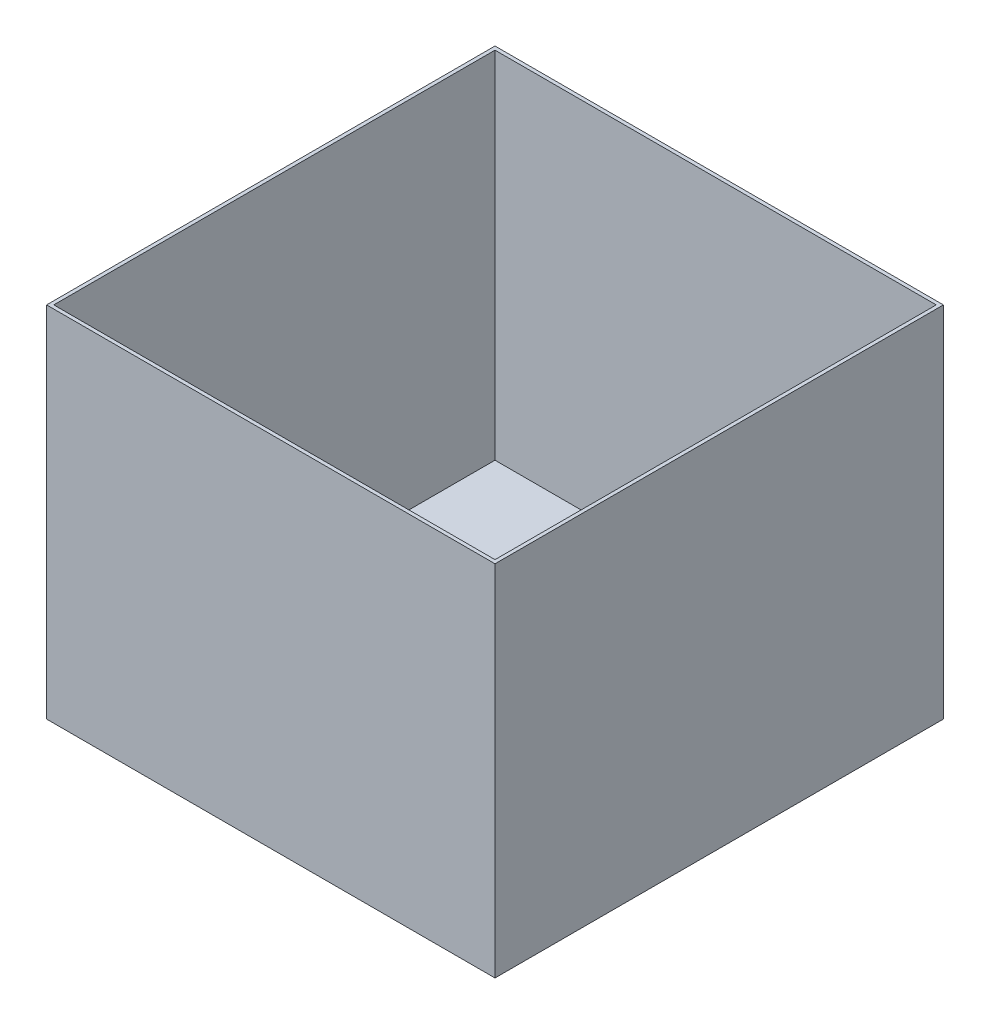
ISO-10303-21;
HEADER;
FILE_DESCRIPTION(('STEP AP214'),'2;1');
FILE_NAME('part.step','',(''),(''),'','','');
FILE_SCHEMA(('AUTOMOTIVE_DESIGN { 1 0 10303 214 1 1 1 1 }'));
ENDSEC;
DATA;
#1=APPLICATION_CONTEXT('core data for automotive mechanical design processes');
#2=APPLICATION_PROTOCOL_DEFINITION('international standard','automotive_design',2000,#1);
#3=PRODUCT_CONTEXT('',#1,'mechanical');
#4=PRODUCT('Part','Part','',(#3));
#5=PRODUCT_RELATED_PRODUCT_CATEGORY('part','',(#4));
#6=PRODUCT_DEFINITION_FORMATION('','',#4);
#7=PRODUCT_DEFINITION_CONTEXT('part definition',#1,'design');
#8=PRODUCT_DEFINITION('design','',#6,#7);
#9=PRODUCT_DEFINITION_SHAPE('','',#8);
#10=(LENGTH_UNIT() NAMED_UNIT(*) SI_UNIT(.MILLI.,.METRE.));
#11=(NAMED_UNIT(*) PLANE_ANGLE_UNIT() SI_UNIT($,.RADIAN.));
#12=(NAMED_UNIT(*) SI_UNIT($,.STERADIAN.) SOLID_ANGLE_UNIT());
#13=UNCERTAINTY_MEASURE_WITH_UNIT(LENGTH_MEASURE(1.E-05),#10,'distance_accuracy_value','');
#14=(GEOMETRIC_REPRESENTATION_CONTEXT(3) GLOBAL_UNCERTAINTY_ASSIGNED_CONTEXT((#13)) GLOBAL_UNIT_ASSIGNED_CONTEXT((#10,
#11,#12)) REPRESENTATION_CONTEXT('',''));
#15=CARTESIAN_POINT('',(0.,0.,0.));
#16=DIRECTION('',(0.,0.,1.));
#17=DIRECTION('',(1.,0.,0.));
#18=AXIS2_PLACEMENT_3D('',#15,#16,#17);
#19=CARTESIAN_POINT('',(0.,200.,0.));
#20=DIRECTION('',(1.,0.,0.));
#21=DIRECTION('',(0.,0.,-1.));
#22=AXIS2_PLACEMENT_3D('',#19,#20,#21);
#23=PLANE('',#22);
#24=DIRECTION('',(0.,0.,1.));
#25=VECTOR('',#24,1.);
#26=CARTESIAN_POINT('',(0.,0.,0.));
#27=LINE('',#26,#25);
#28=CARTESIAN_POINT('',(0.,0.,0.));
#29=VERTEX_POINT('',#28);
#30=CARTESIAN_POINT('',(0.,0.,250.));
#31=VERTEX_POINT('',#30);
#32=EDGE_CURVE('E148',#29,#31,#27,.T.);
#33=ORIENTED_EDGE('',*,*,#32,.T.);
#34=DIRECTION('',(0.,-1.,0.));
#35=VECTOR('',#34,1.);
#36=CARTESIAN_POINT('',(0.,200.,250.));
#37=LINE('',#36,#35);
#38=CARTESIAN_POINT('',(0.,200.,250.));
#39=VERTEX_POINT('',#38);
#40=EDGE_CURVE('E11',#39,#31,#37,.T.);
#41=ORIENTED_EDGE('',*,*,#40,.F.);
#42=DIRECTION('',(0.,0.,1.));
#43=VECTOR('',#42,1.);
#44=CARTESIAN_POINT('',(0.,200.,0.));
#45=LINE('',#44,#43);
#46=CARTESIAN_POINT('',(0.,200.,0.));
#47=VERTEX_POINT('',#46);
#48=EDGE_CURVE('E141',#47,#39,#45,.T.);
#49=ORIENTED_EDGE('',*,*,#48,.F.);
#50=DIRECTION('',(0.,-1.,0.));
#51=VECTOR('',#50,1.);
#52=CARTESIAN_POINT('',(0.,200.,0.));
#53=LINE('',#52,#51);
#54=EDGE_CURVE('E147',#47,#29,#53,.T.);
#55=ORIENTED_EDGE('',*,*,#54,.T.);
#56=EDGE_LOOP('',(#33,#41,#49,#55));
#57=FACE_BOUND('',#56,.T.);
#58=ADVANCED_FACE('F34',(#57),#23,.F.);
#59=CARTESIAN_POINT('',(0.,200.,250.));
#60=DIRECTION('',(0.,0.,-1.));
#61=DIRECTION('',(-1.,0.,0.));
#62=AXIS2_PLACEMENT_3D('',#59,#60,#61);
#63=PLANE('',#62);
#64=DIRECTION('',(1.,0.,0.));
#65=VECTOR('',#64,1.);
#66=CARTESIAN_POINT('',(0.,0.,250.));
#67=LINE('',#66,#65);
#68=CARTESIAN_POINT('',(250.,0.,250.));
#69=VERTEX_POINT('',#68);
#70=EDGE_CURVE('E151',#31,#69,#67,.T.);
#71=ORIENTED_EDGE('',*,*,#70,.T.);
#72=DIRECTION('',(0.,-1.,0.));
#73=VECTOR('',#72,1.);
#74=CARTESIAN_POINT('',(250.,200.,250.));
#75=LINE('',#74,#73);
#76=CARTESIAN_POINT('',(250.,200.,250.));
#77=VERTEX_POINT('',#76);
#78=EDGE_CURVE('E41',#77,#69,#75,.T.);
#79=ORIENTED_EDGE('',*,*,#78,.F.);
#80=DIRECTION('',(1.,0.,0.));
#81=VECTOR('',#80,1.);
#82=CARTESIAN_POINT('',(0.,200.,250.));
#83=LINE('',#82,#81);
#84=EDGE_CURVE('E85',#39,#77,#83,.T.);
#85=ORIENTED_EDGE('',*,*,#84,.F.);
#86=ORIENTED_EDGE('',*,*,#40,.T.);
#87=EDGE_LOOP('',(#71,#79,#85,#86));
#88=FACE_BOUND('',#87,.T.);
#89=ADVANCED_FACE('F180',(#88),#63,.F.);
#90=CARTESIAN_POINT('',(250.,200.,0.));
#91=DIRECTION('',(-1.,0.,0.));
#92=DIRECTION('',(0.,0.,1.));
#93=AXIS2_PLACEMENT_3D('',#90,#91,#92);
#94=PLANE('',#93);
#95=DIRECTION('',(0.,0.,-1.));
#96=VECTOR('',#95,1.);
#97=CARTESIAN_POINT('',(250.,0.,0.));
#98=LINE('',#97,#96);
#99=CARTESIAN_POINT('',(250.,0.,0.));
#100=VERTEX_POINT('',#99);
#101=EDGE_CURVE('E153',#69,#100,#98,.T.);
#102=ORIENTED_EDGE('',*,*,#101,.T.);
#103=DIRECTION('',(0.,-1.,0.));
#104=VECTOR('',#103,1.);
#105=CARTESIAN_POINT('',(250.,200.,0.));
#106=LINE('',#105,#104);
#107=CARTESIAN_POINT('',(250.,200.,0.));
#108=VERTEX_POINT('',#107);
#109=EDGE_CURVE('E157',#108,#100,#106,.T.);
#110=ORIENTED_EDGE('',*,*,#109,.F.);
#111=DIRECTION('',(0.,0.,-1.));
#112=VECTOR('',#111,1.);
#113=CARTESIAN_POINT('',(250.,200.,0.));
#114=LINE('',#113,#112);
#115=EDGE_CURVE('E144',#77,#108,#114,.T.);
#116=ORIENTED_EDGE('',*,*,#115,.F.);
#117=ORIENTED_EDGE('',*,*,#78,.T.);
#118=EDGE_LOOP('',(#102,#110,#116,#117));
#119=FACE_BOUND('',#118,.T.);
#120=ADVANCED_FACE('F162',(#119),#94,.F.);
#121=CARTESIAN_POINT('',(0.,200.,0.));
#122=DIRECTION('',(0.,0.,1.));
#123=DIRECTION('',(1.,0.,0.));
#124=AXIS2_PLACEMENT_3D('',#121,#122,#123);
#125=PLANE('',#124);
#126=DIRECTION('',(-1.,0.,0.));
#127=VECTOR('',#126,1.);
#128=CARTESIAN_POINT('',(0.,0.,0.));
#129=LINE('',#128,#127);
#130=EDGE_CURVE('E78',#100,#29,#129,.T.);
#131=ORIENTED_EDGE('',*,*,#130,.T.);
#132=ORIENTED_EDGE('',*,*,#54,.F.);
#133=DIRECTION('',(-1.,0.,0.));
#134=VECTOR('',#133,1.);
#135=CARTESIAN_POINT('',(0.,200.,0.));
#136=LINE('',#135,#134);
#137=EDGE_CURVE('E57',#108,#47,#136,.T.);
#138=ORIENTED_EDGE('',*,*,#137,.F.);
#139=ORIENTED_EDGE('',*,*,#109,.T.);
#140=EDGE_LOOP('',(#131,#132,#138,#139));
#141=FACE_BOUND('',#140,.T.);
#142=ADVANCED_FACE('F170',(#141),#125,.F.);
#143=CARTESIAN_POINT('',(0.,200.,0.));
#144=DIRECTION('',(0.,1.,0.));
#145=DIRECTION('',(0.,0.,1.));
#146=AXIS2_PLACEMENT_3D('',#143,#144,#145);
#147=PLANE('',#146);
#148=DIRECTION('',(0.,0.,1.));
#149=VECTOR('',#148,1.);
#150=CARTESIAN_POINT('',(2.,200.,0.));
#151=LINE('',#150,#149);
#152=CARTESIAN_POINT('',(2.,200.,2.));
#153=VERTEX_POINT('',#152);
#154=CARTESIAN_POINT('',(2.00000000000003,200.,248.));
#155=VERTEX_POINT('',#154);
#156=EDGE_CURVE('E130',#153,#155,#151,.T.);
#157=ORIENTED_EDGE('',*,*,#156,.F.);
#158=DIRECTION('',(-1.,0.,0.));
#159=VECTOR('',#158,1.);
#160=CARTESIAN_POINT('',(0.,200.,2.));
#161=LINE('',#160,#159);
#162=CARTESIAN_POINT('',(248.,200.,2.));
#163=VERTEX_POINT('',#162);
#164=EDGE_CURVE('E139',#163,#153,#161,.T.);
#165=ORIENTED_EDGE('',*,*,#164,.F.);
#166=DIRECTION('',(0.,0.,-1.));
#167=VECTOR('',#166,1.);
#168=CARTESIAN_POINT('',(248.,200.,0.));
#169=LINE('',#168,#167);
#170=CARTESIAN_POINT('',(248.,200.,248.));
#171=VERTEX_POINT('',#170);
#172=EDGE_CURVE('E137',#171,#163,#169,.T.);
#173=ORIENTED_EDGE('',*,*,#172,.F.);
#174=DIRECTION('',(1.,0.,0.));
#175=VECTOR('',#174,1.);
#176=CARTESIAN_POINT('',(0.,200.,248.));
#177=LINE('',#176,#175);
#178=EDGE_CURVE('E122',#155,#171,#177,.T.);
#179=ORIENTED_EDGE('',*,*,#178,.F.);
#180=EDGE_LOOP('',(#157,#165,#173,#179));
#181=FACE_BOUND('',#180,.T.);
#182=ORIENTED_EDGE('',*,*,#48,.T.);
#183=ORIENTED_EDGE('',*,*,#84,.T.);
#184=ORIENTED_EDGE('',*,*,#115,.T.);
#185=ORIENTED_EDGE('',*,*,#137,.T.);
#186=EDGE_LOOP('',(#182,#183,#184,#185));
#187=FACE_BOUND('',#186,.T.);
#188=ADVANCED_FACE('F172',(#181,#187),#147,.T.);
#189=CARTESIAN_POINT('',(0.,0.,0.));
#190=DIRECTION('',(0.,1.,0.));
#191=DIRECTION('',(0.,0.,1.));
#192=AXIS2_PLACEMENT_3D('',#189,#190,#191);
#193=PLANE('',#192);
#194=ORIENTED_EDGE('',*,*,#32,.F.);
#195=ORIENTED_EDGE('',*,*,#130,.F.);
#196=ORIENTED_EDGE('',*,*,#101,.F.);
#197=ORIENTED_EDGE('',*,*,#70,.F.);
#198=EDGE_LOOP('',(#194,#195,#196,#197));
#199=FACE_BOUND('',#198,.T.);
#200=ADVANCED_FACE('F166',(#199),#193,.F.);
#201=CARTESIAN_POINT('',(2.,200.,0.));
#202=DIRECTION('',(1.,0.,0.));
#203=DIRECTION('',(0.,0.,-1.));
#204=AXIS2_PLACEMENT_3D('',#201,#202,#203);
#205=PLANE('',#204);
#206=DIRECTION('',(0.,0.,1.));
#207=VECTOR('',#206,1.);
#208=CARTESIAN_POINT('',(2.,2.,0.));
#209=LINE('',#208,#207);
#210=CARTESIAN_POINT('',(2.,2.,2.));
#211=VERTEX_POINT('',#210);
#212=CARTESIAN_POINT('',(2.00000000000003,2.,248.));
#213=VERTEX_POINT('',#212);
#214=EDGE_CURVE('E113',#211,#213,#209,.T.);
#215=ORIENTED_EDGE('',*,*,#214,.F.);
#216=DIRECTION('',(0.,-1.,0.));
#217=VECTOR('',#216,1.);
#218=CARTESIAN_POINT('',(2.,200.,2.));
#219=LINE('',#218,#217);
#220=EDGE_CURVE('E133',#153,#211,#219,.T.);
#221=ORIENTED_EDGE('',*,*,#220,.F.);
#222=ORIENTED_EDGE('',*,*,#156,.T.);
#223=DIRECTION('',(0.,-1.,0.));
#224=VECTOR('',#223,1.);
#225=CARTESIAN_POINT('',(2.00000000000003,200.,248.));
#226=LINE('',#225,#224);
#227=EDGE_CURVE('E125',#155,#213,#226,.T.);
#228=ORIENTED_EDGE('',*,*,#227,.T.);
#229=EDGE_LOOP('',(#215,#221,#222,#228));
#230=FACE_BOUND('',#229,.T.);
#231=ADVANCED_FACE('F209',(#230),#205,.T.);
#232=CARTESIAN_POINT('',(0.,200.,248.));
#233=DIRECTION('',(0.,0.,-1.));
#234=DIRECTION('',(-1.,0.,0.));
#235=AXIS2_PLACEMENT_3D('',#232,#233,#234);
#236=PLANE('',#235);
#237=DIRECTION('',(1.,0.,0.));
#238=VECTOR('',#237,1.);
#239=CARTESIAN_POINT('',(0.,2.,248.));
#240=LINE('',#239,#238);
#241=CARTESIAN_POINT('',(248.,2.,248.));
#242=VERTEX_POINT('',#241);
#243=EDGE_CURVE('E107',#213,#242,#240,.T.);
#244=ORIENTED_EDGE('',*,*,#243,.F.);
#245=ORIENTED_EDGE('',*,*,#227,.F.);
#246=ORIENTED_EDGE('',*,*,#178,.T.);
#247=DIRECTION('',(0.,-1.,0.));
#248=VECTOR('',#247,1.);
#249=CARTESIAN_POINT('',(248.,200.,248.));
#250=LINE('',#249,#248);
#251=EDGE_CURVE('E119',#171,#242,#250,.T.);
#252=ORIENTED_EDGE('',*,*,#251,.T.);
#253=EDGE_LOOP('',(#244,#245,#246,#252));
#254=FACE_BOUND('',#253,.T.);
#255=ADVANCED_FACE('F120',(#254),#236,.T.);
#256=CARTESIAN_POINT('',(248.,200.,0.));
#257=DIRECTION('',(-1.,0.,0.));
#258=DIRECTION('',(0.,0.,1.));
#259=AXIS2_PLACEMENT_3D('',#256,#257,#258);
#260=PLANE('',#259);
#261=DIRECTION('',(0.,0.,-1.));
#262=VECTOR('',#261,1.);
#263=CARTESIAN_POINT('',(248.,2.,0.));
#264=LINE('',#263,#262);
#265=CARTESIAN_POINT('',(248.,2.,2.));
#266=VERTEX_POINT('',#265);
#267=EDGE_CURVE('E111',#242,#266,#264,.T.);
#268=ORIENTED_EDGE('',*,*,#267,.F.);
#269=ORIENTED_EDGE('',*,*,#251,.F.);
#270=ORIENTED_EDGE('',*,*,#172,.T.);
#271=DIRECTION('',(0.,-1.,0.));
#272=VECTOR('',#271,1.);
#273=CARTESIAN_POINT('',(248.,200.,2.));
#274=LINE('',#273,#272);
#275=EDGE_CURVE('E48',#163,#266,#274,.T.);
#276=ORIENTED_EDGE('',*,*,#275,.T.);
#277=EDGE_LOOP('',(#268,#269,#270,#276));
#278=FACE_BOUND('',#277,.T.);
#279=ADVANCED_FACE('F127',(#278),#260,.T.);
#280=CARTESIAN_POINT('',(0.,200.,2.));
#281=DIRECTION('',(0.,0.,1.));
#282=DIRECTION('',(1.,0.,0.));
#283=AXIS2_PLACEMENT_3D('',#280,#281,#282);
#284=PLANE('',#283);
#285=DIRECTION('',(-1.,0.,0.));
#286=VECTOR('',#285,1.);
#287=CARTESIAN_POINT('',(0.,2.,2.));
#288=LINE('',#287,#286);
#289=EDGE_CURVE('E128',#266,#211,#288,.T.);
#290=ORIENTED_EDGE('',*,*,#289,.F.);
#291=ORIENTED_EDGE('',*,*,#275,.F.);
#292=ORIENTED_EDGE('',*,*,#164,.T.);
#293=ORIENTED_EDGE('',*,*,#220,.T.);
#294=EDGE_LOOP('',(#290,#291,#292,#293));
#295=FACE_BOUND('',#294,.T.);
#296=ADVANCED_FACE('F239',(#295),#284,.T.);
#297=CARTESIAN_POINT('',(0.,2.,0.));
#298=DIRECTION('',(0.,1.,0.));
#299=DIRECTION('',(0.,0.,1.));
#300=AXIS2_PLACEMENT_3D('',#297,#298,#299);
#301=PLANE('',#300);
#302=ORIENTED_EDGE('',*,*,#214,.T.);
#303=ORIENTED_EDGE('',*,*,#243,.T.);
#304=ORIENTED_EDGE('',*,*,#267,.T.);
#305=ORIENTED_EDGE('',*,*,#289,.T.);
#306=EDGE_LOOP('',(#302,#303,#304,#305));
#307=FACE_BOUND('',#306,.T.);
#308=ADVANCED_FACE('F109',(#307),#301,.T.);
#309=CLOSED_SHELL('',(#58,#89,#120,#142,#188,#200,#231,#255,#279,#296,#308));
#310=MANIFOLD_SOLID_BREP('B2',#309);
#311=ADVANCED_BREP_SHAPE_REPRESENTATION('',(#18,#310),#14);
#312=SHAPE_DEFINITION_REPRESENTATION(#9,#311);
ENDSEC;
END-ISO-10303-21;
